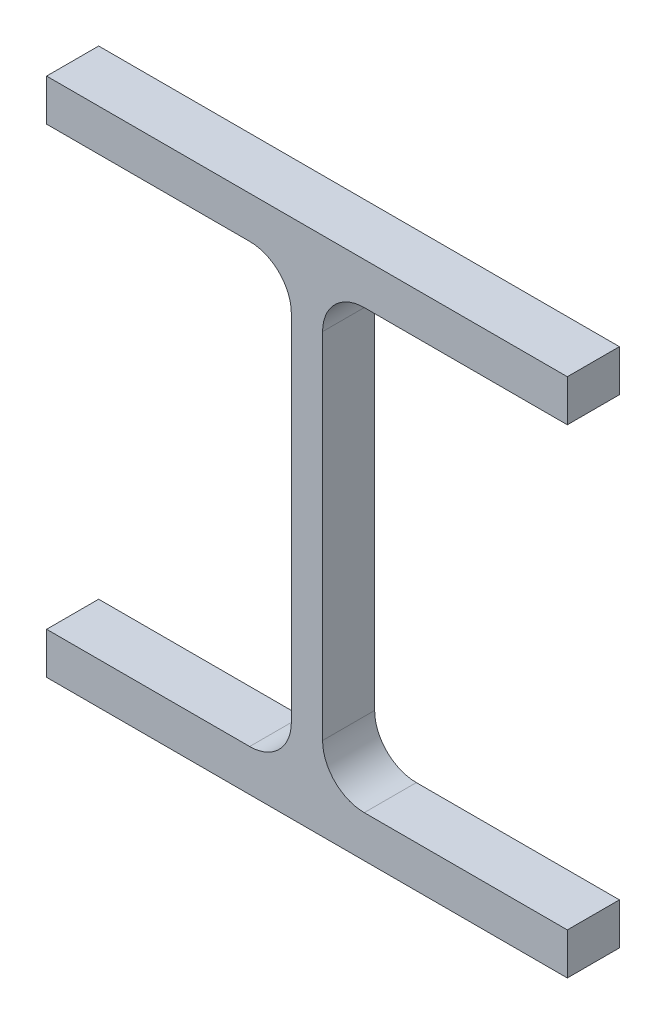
ISO-10303-21;
HEADER;
FILE_DESCRIPTION(('STEP AP214'),'2;1');
FILE_NAME('part.step','',(''),(''),'','','');
FILE_SCHEMA(('AUTOMOTIVE_DESIGN { 1 0 10303 214 1 1 1 1 }'));
ENDSEC;
DATA;
#1=APPLICATION_CONTEXT('core data for automotive mechanical design processes');
#2=APPLICATION_PROTOCOL_DEFINITION('international standard','automotive_design',2000,#1);
#3=PRODUCT_CONTEXT('',#1,'mechanical');
#4=PRODUCT('Part','Part','',(#3));
#5=PRODUCT_RELATED_PRODUCT_CATEGORY('part','',(#4));
#6=PRODUCT_DEFINITION_FORMATION('','',#4);
#7=PRODUCT_DEFINITION_CONTEXT('part definition',#1,'design');
#8=PRODUCT_DEFINITION('design','',#6,#7);
#9=PRODUCT_DEFINITION_SHAPE('','',#8);
#10=(LENGTH_UNIT() NAMED_UNIT(*) SI_UNIT(.MILLI.,.METRE.));
#11=(NAMED_UNIT(*) PLANE_ANGLE_UNIT() SI_UNIT($,.RADIAN.));
#12=(NAMED_UNIT(*) SI_UNIT($,.STERADIAN.) SOLID_ANGLE_UNIT());
#13=UNCERTAINTY_MEASURE_WITH_UNIT(LENGTH_MEASURE(1.E-05),#10,'distance_accuracy_value','');
#14=(GEOMETRIC_REPRESENTATION_CONTEXT(3) GLOBAL_UNCERTAINTY_ASSIGNED_CONTEXT((#13)) GLOBAL_UNIT_ASSIGNED_CONTEXT((#10,
#11,#12)) REPRESENTATION_CONTEXT('',''));
#15=CARTESIAN_POINT('',(0.,0.,0.));
#16=DIRECTION('',(0.,0.,1.));
#17=DIRECTION('',(1.,0.,0.));
#18=AXIS2_PLACEMENT_3D('',#15,#16,#17);
#19=CARTESIAN_POINT('',(50.,-50.,10.));
#20=DIRECTION('',(-1.,0.,0.));
#21=DIRECTION('',(0.,-1.,0.));
#22=AXIS2_PLACEMENT_3D('',#19,#20,#21);
#23=PLANE('',#22);
#24=DIRECTION('',(0.,1.,0.));
#25=VECTOR('',#24,1.);
#26=CARTESIAN_POINT('',(50.,-50.,0.));
#27=LINE('',#26,#25);
#28=CARTESIAN_POINT('',(50.,-50.,0.));
#29=VERTEX_POINT('',#28);
#30=CARTESIAN_POINT('',(50.,-42.,0.));
#31=VERTEX_POINT('',#30);
#32=EDGE_CURVE('E171',#29,#31,#27,.T.);
#33=ORIENTED_EDGE('',*,*,#32,.T.);
#34=DIRECTION('',(0.,0.,-1.));
#35=VECTOR('',#34,1.);
#36=CARTESIAN_POINT('',(50.,-42.,10.));
#37=LINE('',#36,#35);
#38=CARTESIAN_POINT('',(50.,-42.,10.));
#39=VERTEX_POINT('',#38);
#40=EDGE_CURVE('E152',#39,#31,#37,.T.);
#41=ORIENTED_EDGE('',*,*,#40,.F.);
#42=DIRECTION('',(0.,1.,0.));
#43=VECTOR('',#42,1.);
#44=CARTESIAN_POINT('',(50.,-50.,10.));
#45=LINE('',#44,#43);
#46=CARTESIAN_POINT('',(50.,-50.,10.));
#47=VERTEX_POINT('',#46);
#48=EDGE_CURVE('E159',#47,#39,#45,.T.);
#49=ORIENTED_EDGE('',*,*,#48,.F.);
#50=DIRECTION('',(0.,0.,-1.));
#51=VECTOR('',#50,1.);
#52=CARTESIAN_POINT('',(50.,-50.,10.));
#53=LINE('',#52,#51);
#54=EDGE_CURVE('E255',#47,#29,#53,.T.);
#55=ORIENTED_EDGE('',*,*,#54,.T.);
#56=EDGE_LOOP('',(#33,#41,#49,#55));
#57=FACE_BOUND('',#56,.T.);
#58=ADVANCED_FACE('F34',(#57),#23,.F.);
#59=CARTESIAN_POINT('',(50.,-42.,10.));
#60=DIRECTION('',(0.,-1.,0.));
#61=DIRECTION('',(1.,0.,0.));
#62=AXIS2_PLACEMENT_3D('',#59,#60,#61);
#63=PLANE('',#62);
#64=DIRECTION('',(-1.,0.,0.));
#65=VECTOR('',#64,1.);
#66=CARTESIAN_POINT('',(50.,-42.,0.));
#67=LINE('',#66,#65);
#68=CARTESIAN_POINT('',(11.,-42.,0.));
#69=VERTEX_POINT('',#68);
#70=EDGE_CURVE('E233',#31,#69,#67,.T.);
#71=ORIENTED_EDGE('',*,*,#70,.T.);
#72=DIRECTION('',(0.,0.,-1.));
#73=VECTOR('',#72,1.);
#74=CARTESIAN_POINT('',(11.,-42.,10.));
#75=LINE('',#74,#73);
#76=CARTESIAN_POINT('',(11.,-42.,10.));
#77=VERTEX_POINT('',#76);
#78=EDGE_CURVE('E155',#69,#77,#75,.F.);
#79=ORIENTED_EDGE('',*,*,#78,.T.);
#80=DIRECTION('',(-1.,0.,0.));
#81=VECTOR('',#80,1.);
#82=CARTESIAN_POINT('',(50.,-42.,10.));
#83=LINE('',#82,#81);
#84=EDGE_CURVE('E147',#39,#77,#83,.T.);
#85=ORIENTED_EDGE('',*,*,#84,.F.);
#86=ORIENTED_EDGE('',*,*,#40,.T.);
#87=EDGE_LOOP('',(#71,#79,#85,#86));
#88=FACE_BOUND('',#87,.T.);
#89=ADVANCED_FACE('F150',(#88),#63,.F.);
#90=CARTESIAN_POINT('',(2.99999999999999,42.,10.));
#91=DIRECTION('',(-1.,0.,0.));
#92=DIRECTION('',(0.,0.,1.));
#93=AXIS2_PLACEMENT_3D('',#90,#91,#92);
#94=PLANE('',#93);
#95=DIRECTION('',(0.,1.,0.));
#96=VECTOR('',#95,1.);
#97=CARTESIAN_POINT('',(2.99999999999999,42.,10.));
#98=LINE('',#97,#96);
#99=CARTESIAN_POINT('',(2.99999999999999,-34.,10.));
#100=VERTEX_POINT('',#99);
#101=CARTESIAN_POINT('',(2.99999999999999,34.,10.));
#102=VERTEX_POINT('',#101);
#103=EDGE_CURVE('E158',#100,#102,#98,.T.);
#104=ORIENTED_EDGE('',*,*,#103,.F.);
#105=DIRECTION('',(0.,0.,-1.));
#106=VECTOR('',#105,1.);
#107=CARTESIAN_POINT('',(2.99999999999999,-34.,0.));
#108=LINE('',#107,#106);
#109=CARTESIAN_POINT('',(2.99999999999999,-34.,0.));
#110=VERTEX_POINT('',#109);
#111=EDGE_CURVE('E189',#100,#110,#108,.T.);
#112=ORIENTED_EDGE('',*,*,#111,.T.);
#113=DIRECTION('',(0.,1.,0.));
#114=VECTOR('',#113,1.);
#115=CARTESIAN_POINT('',(2.99999999999999,42.,0.));
#116=LINE('',#115,#114);
#117=CARTESIAN_POINT('',(2.99999999999999,34.,0.));
#118=VERTEX_POINT('',#117);
#119=EDGE_CURVE('E227',#110,#118,#116,.T.);
#120=ORIENTED_EDGE('',*,*,#119,.T.);
#121=DIRECTION('',(0.,0.,-1.));
#122=VECTOR('',#121,1.);
#123=CARTESIAN_POINT('',(2.99999999999999,34.,10.));
#124=LINE('',#123,#122);
#125=EDGE_CURVE('E187',#118,#102,#124,.F.);
#126=ORIENTED_EDGE('',*,*,#125,.T.);
#127=EDGE_LOOP('',(#104,#112,#120,#126));
#128=FACE_BOUND('',#127,.T.);
#129=ADVANCED_FACE('F231',(#128),#94,.F.);
#130=CARTESIAN_POINT('',(50.,42.,10.));
#131=DIRECTION('',(0.,1.,0.));
#132=DIRECTION('',(-1.,0.,0.));
#133=AXIS2_PLACEMENT_3D('',#130,#131,#132);
#134=PLANE('',#133);
#135=DIRECTION('',(1.,0.,0.));
#136=VECTOR('',#135,1.);
#137=CARTESIAN_POINT('',(50.,42.,10.));
#138=LINE('',#137,#136);
#139=CARTESIAN_POINT('',(11.,42.,10.));
#140=VERTEX_POINT('',#139);
#141=CARTESIAN_POINT('',(50.,42.,10.));
#142=VERTEX_POINT('',#141);
#143=EDGE_CURVE('E211',#140,#142,#138,.T.);
#144=ORIENTED_EDGE('',*,*,#143,.F.);
#145=DIRECTION('',(0.,0.,-1.));
#146=VECTOR('',#145,1.);
#147=CARTESIAN_POINT('',(11.,42.,0.));
#148=LINE('',#147,#146);
#149=CARTESIAN_POINT('',(11.,42.,0.));
#150=VERTEX_POINT('',#149);
#151=EDGE_CURVE('E193',#140,#150,#148,.T.);
#152=ORIENTED_EDGE('',*,*,#151,.T.);
#153=DIRECTION('',(1.,0.,0.));
#154=VECTOR('',#153,1.);
#155=CARTESIAN_POINT('',(50.,42.,0.));
#156=LINE('',#155,#154);
#157=CARTESIAN_POINT('',(50.,42.,0.));
#158=VERTEX_POINT('',#157);
#159=EDGE_CURVE('E229',#150,#158,#156,.T.);
#160=ORIENTED_EDGE('',*,*,#159,.T.);
#161=DIRECTION('',(0.,0.,-1.));
#162=VECTOR('',#161,1.);
#163=CARTESIAN_POINT('',(50.,42.,10.));
#164=LINE('',#163,#162);
#165=EDGE_CURVE('E173',#142,#158,#164,.T.);
#166=ORIENTED_EDGE('',*,*,#165,.F.);
#167=EDGE_LOOP('',(#144,#152,#160,#166));
#168=FACE_BOUND('',#167,.T.);
#169=ADVANCED_FACE('F218',(#168),#134,.F.);
#170=CARTESIAN_POINT('',(50.,50.,10.));
#171=DIRECTION('',(-1.,0.,0.));
#172=DIRECTION('',(0.,-1.,0.));
#173=AXIS2_PLACEMENT_3D('',#170,#171,#172);
#174=PLANE('',#173);
#175=DIRECTION('',(0.,1.,0.));
#176=VECTOR('',#175,1.);
#177=CARTESIAN_POINT('',(50.,50.,0.));
#178=LINE('',#177,#176);
#179=CARTESIAN_POINT('',(50.,50.,0.));
#180=VERTEX_POINT('',#179);
#181=EDGE_CURVE('E235',#158,#180,#178,.T.);
#182=ORIENTED_EDGE('',*,*,#181,.T.);
#183=DIRECTION('',(0.,0.,-1.));
#184=VECTOR('',#183,1.);
#185=CARTESIAN_POINT('',(50.,50.,10.));
#186=LINE('',#185,#184);
#187=CARTESIAN_POINT('',(50.,50.,10.));
#188=VERTEX_POINT('',#187);
#189=EDGE_CURVE('E179',#188,#180,#186,.T.);
#190=ORIENTED_EDGE('',*,*,#189,.F.);
#191=DIRECTION('',(0.,1.,0.));
#192=VECTOR('',#191,1.);
#193=CARTESIAN_POINT('',(50.,50.,10.));
#194=LINE('',#193,#192);
#195=EDGE_CURVE('E221',#142,#188,#194,.T.);
#196=ORIENTED_EDGE('',*,*,#195,.F.);
#197=ORIENTED_EDGE('',*,*,#165,.T.);
#198=EDGE_LOOP('',(#182,#190,#196,#197));
#199=FACE_BOUND('',#198,.T.);
#200=ADVANCED_FACE('F311',(#199),#174,.F.);
#201=CARTESIAN_POINT('',(50.,50.,10.));
#202=DIRECTION('',(0.,-1.,0.));
#203=DIRECTION('',(0.,0.,-1.));
#204=AXIS2_PLACEMENT_3D('',#201,#202,#203);
#205=PLANE('',#204);
#206=DIRECTION('',(-1.,0.,0.));
#207=VECTOR('',#206,1.);
#208=CARTESIAN_POINT('',(50.,50.,0.));
#209=LINE('',#208,#207);
#210=CARTESIAN_POINT('',(-50.,50.,0.));
#211=VERTEX_POINT('',#210);
#212=EDGE_CURVE('E241',#180,#211,#209,.T.);
#213=ORIENTED_EDGE('',*,*,#212,.T.);
#214=DIRECTION('',(0.,0.,-1.));
#215=VECTOR('',#214,1.);
#216=CARTESIAN_POINT('',(-50.,50.,10.));
#217=LINE('',#216,#215);
#218=CARTESIAN_POINT('',(-50.,50.,10.));
#219=VERTEX_POINT('',#218);
#220=EDGE_CURVE('E266',#219,#211,#217,.T.);
#221=ORIENTED_EDGE('',*,*,#220,.F.);
#222=DIRECTION('',(-1.,0.,0.));
#223=VECTOR('',#222,1.);
#224=CARTESIAN_POINT('',(50.,50.,10.));
#225=LINE('',#224,#223);
#226=EDGE_CURVE('E275',#188,#219,#225,.T.);
#227=ORIENTED_EDGE('',*,*,#226,.F.);
#228=ORIENTED_EDGE('',*,*,#189,.T.);
#229=EDGE_LOOP('',(#213,#221,#227,#228));
#230=FACE_BOUND('',#229,.T.);
#231=ADVANCED_FACE('F273',(#230),#205,.F.);
#232=CARTESIAN_POINT('',(-50.,50.,10.));
#233=DIRECTION('',(1.,0.,0.));
#234=DIRECTION('',(0.,1.,0.));
#235=AXIS2_PLACEMENT_3D('',#232,#233,#234);
#236=PLANE('',#235);
#237=DIRECTION('',(0.,-1.,0.));
#238=VECTOR('',#237,1.);
#239=CARTESIAN_POINT('',(-50.,50.,0.));
#240=LINE('',#239,#238);
#241=CARTESIAN_POINT('',(-50.,42.,0.));
#242=VERTEX_POINT('',#241);
#243=EDGE_CURVE('E243',#211,#242,#240,.T.);
#244=ORIENTED_EDGE('',*,*,#243,.T.);
#245=DIRECTION('',(0.,0.,-1.));
#246=VECTOR('',#245,1.);
#247=CARTESIAN_POINT('',(-50.,42.,10.));
#248=LINE('',#247,#246);
#249=CARTESIAN_POINT('',(-50.,42.,10.));
#250=VERTEX_POINT('',#249);
#251=EDGE_CURVE('E263',#250,#242,#248,.T.);
#252=ORIENTED_EDGE('',*,*,#251,.F.);
#253=DIRECTION('',(0.,-1.,0.));
#254=VECTOR('',#253,1.);
#255=CARTESIAN_POINT('',(-50.,50.,10.));
#256=LINE('',#255,#254);
#257=EDGE_CURVE('E286',#219,#250,#256,.T.);
#258=ORIENTED_EDGE('',*,*,#257,.F.);
#259=ORIENTED_EDGE('',*,*,#220,.T.);
#260=EDGE_LOOP('',(#244,#252,#258,#259));
#261=FACE_BOUND('',#260,.T.);
#262=ADVANCED_FACE('F280',(#261),#236,.F.);
#263=CARTESIAN_POINT('',(-50.,42.,10.));
#264=DIRECTION('',(0.,1.,0.));
#265=DIRECTION('',(-1.,0.,0.));
#266=AXIS2_PLACEMENT_3D('',#263,#264,#265);
#267=PLANE('',#266);
#268=DIRECTION('',(1.,0.,0.));
#269=VECTOR('',#268,1.);
#270=CARTESIAN_POINT('',(-50.,42.,0.));
#271=LINE('',#270,#269);
#272=CARTESIAN_POINT('',(-11.,42.,0.));
#273=VERTEX_POINT('',#272);
#274=EDGE_CURVE('E245',#242,#273,#271,.T.);
#275=ORIENTED_EDGE('',*,*,#274,.T.);
#276=DIRECTION('',(0.,0.,-1.));
#277=VECTOR('',#276,1.);
#278=CARTESIAN_POINT('',(-11.,42.,10.));
#279=LINE('',#278,#277);
#280=CARTESIAN_POINT('',(-11.,42.,10.));
#281=VERTEX_POINT('',#280);
#282=EDGE_CURVE('E49',#273,#281,#279,.F.);
#283=ORIENTED_EDGE('',*,*,#282,.T.);
#284=DIRECTION('',(1.,0.,0.));
#285=VECTOR('',#284,1.);
#286=CARTESIAN_POINT('',(-50.,42.,10.));
#287=LINE('',#286,#285);
#288=EDGE_CURVE('E283',#250,#281,#287,.T.);
#289=ORIENTED_EDGE('',*,*,#288,.F.);
#290=ORIENTED_EDGE('',*,*,#251,.T.);
#291=EDGE_LOOP('',(#275,#283,#289,#290));
#292=FACE_BOUND('',#291,.T.);
#293=ADVANCED_FACE('F282',(#292),#267,.F.);
#294=CARTESIAN_POINT('',(-2.99999999999999,42.,10.));
#295=DIRECTION('',(1.,0.,0.));
#296=DIRECTION('',(0.,0.,-1.));
#297=AXIS2_PLACEMENT_3D('',#294,#295,#296);
#298=PLANE('',#297);
#299=DIRECTION('',(0.,-1.,0.));
#300=VECTOR('',#299,1.);
#301=CARTESIAN_POINT('',(-2.99999999999999,42.,0.));
#302=LINE('',#301,#300);
#303=CARTESIAN_POINT('',(-2.99999999999999,34.,0.));
#304=VERTEX_POINT('',#303);
#305=CARTESIAN_POINT('',(-2.99999999999999,-34.,0.));
#306=VERTEX_POINT('',#305);
#307=EDGE_CURVE('E247',#304,#306,#302,.T.);
#308=ORIENTED_EDGE('',*,*,#307,.T.);
#309=DIRECTION('',(0.,0.,-1.));
#310=VECTOR('',#309,1.);
#311=CARTESIAN_POINT('',(-2.99999999999999,-34.,10.));
#312=LINE('',#311,#310);
#313=CARTESIAN_POINT('',(-2.99999999999999,-34.,10.));
#314=VERTEX_POINT('',#313);
#315=EDGE_CURVE('E185',#306,#314,#312,.F.);
#316=ORIENTED_EDGE('',*,*,#315,.T.);
#317=DIRECTION('',(0.,-1.,0.));
#318=VECTOR('',#317,1.);
#319=CARTESIAN_POINT('',(-2.99999999999999,42.,10.));
#320=LINE('',#319,#318);
#321=CARTESIAN_POINT('',(-2.99999999999999,34.,10.));
#322=VERTEX_POINT('',#321);
#323=EDGE_CURVE('E285',#322,#314,#320,.T.);
#324=ORIENTED_EDGE('',*,*,#323,.F.);
#325=DIRECTION('',(0.,0.,-1.));
#326=VECTOR('',#325,1.);
#327=CARTESIAN_POINT('',(-2.99999999999999,34.,0.));
#328=LINE('',#327,#326);
#329=EDGE_CURVE('E176',#322,#304,#328,.T.);
#330=ORIENTED_EDGE('',*,*,#329,.T.);
#331=EDGE_LOOP('',(#308,#316,#324,#330));
#332=FACE_BOUND('',#331,.T.);
#333=ADVANCED_FACE('F344',(#332),#298,.F.);
#334=CARTESIAN_POINT('',(-50.,-42.,10.));
#335=DIRECTION('',(0.,-1.,0.));
#336=DIRECTION('',(1.,0.,0.));
#337=AXIS2_PLACEMENT_3D('',#334,#335,#336);
#338=PLANE('',#337);
#339=DIRECTION('',(-1.,0.,0.));
#340=VECTOR('',#339,1.);
#341=CARTESIAN_POINT('',(-50.,-42.,10.));
#342=LINE('',#341,#340);
#343=CARTESIAN_POINT('',(-11.,-42.,10.));
#344=VERTEX_POINT('',#343);
#345=CARTESIAN_POINT('',(-50.,-42.,10.));
#346=VERTEX_POINT('',#345);
#347=EDGE_CURVE('E289',#344,#346,#342,.T.);
#348=ORIENTED_EDGE('',*,*,#347,.F.);
#349=DIRECTION('',(0.,0.,-1.));
#350=VECTOR('',#349,1.);
#351=CARTESIAN_POINT('',(-11.,-42.,0.));
#352=LINE('',#351,#350);
#353=CARTESIAN_POINT('',(-11.,-42.,0.));
#354=VERTEX_POINT('',#353);
#355=EDGE_CURVE('E172',#344,#354,#352,.T.);
#356=ORIENTED_EDGE('',*,*,#355,.T.);
#357=DIRECTION('',(-1.,0.,0.));
#358=VECTOR('',#357,1.);
#359=CARTESIAN_POINT('',(-50.,-42.,0.));
#360=LINE('',#359,#358);
#361=CARTESIAN_POINT('',(-50.,-42.,0.));
#362=VERTEX_POINT('',#361);
#363=EDGE_CURVE('E250',#354,#362,#360,.T.);
#364=ORIENTED_EDGE('',*,*,#363,.T.);
#365=DIRECTION('',(0.,0.,-1.));
#366=VECTOR('',#365,1.);
#367=CARTESIAN_POINT('',(-50.,-42.,10.));
#368=LINE('',#367,#366);
#369=EDGE_CURVE('E260',#346,#362,#368,.T.);
#370=ORIENTED_EDGE('',*,*,#369,.F.);
#371=EDGE_LOOP('',(#348,#356,#364,#370));
#372=FACE_BOUND('',#371,.T.);
#373=ADVANCED_FACE('F348',(#372),#338,.F.);
#374=CARTESIAN_POINT('',(-50.,-50.,10.));
#375=DIRECTION('',(1.,0.,0.));
#376=DIRECTION('',(0.,1.,0.));
#377=AXIS2_PLACEMENT_3D('',#374,#375,#376);
#378=PLANE('',#377);
#379=DIRECTION('',(0.,-1.,0.));
#380=VECTOR('',#379,1.);
#381=CARTESIAN_POINT('',(-50.,-50.,0.));
#382=LINE('',#381,#380);
#383=CARTESIAN_POINT('',(-50.,-50.,0.));
#384=VERTEX_POINT('',#383);
#385=EDGE_CURVE('E252',#362,#384,#382,.T.);
#386=ORIENTED_EDGE('',*,*,#385,.T.);
#387=DIRECTION('',(0.,0.,-1.));
#388=VECTOR('',#387,1.);
#389=CARTESIAN_POINT('',(-50.,-50.,10.));
#390=LINE('',#389,#388);
#391=CARTESIAN_POINT('',(-50.,-50.,10.));
#392=VERTEX_POINT('',#391);
#393=EDGE_CURVE('E257',#392,#384,#390,.T.);
#394=ORIENTED_EDGE('',*,*,#393,.F.);
#395=DIRECTION('',(0.,-1.,0.));
#396=VECTOR('',#395,1.);
#397=CARTESIAN_POINT('',(-50.,-50.,10.));
#398=LINE('',#397,#396);
#399=EDGE_CURVE('E295',#346,#392,#398,.T.);
#400=ORIENTED_EDGE('',*,*,#399,.F.);
#401=ORIENTED_EDGE('',*,*,#369,.T.);
#402=EDGE_LOOP('',(#386,#394,#400,#401));
#403=FACE_BOUND('',#402,.T.);
#404=ADVANCED_FACE('F302',(#403),#378,.F.);
#405=CARTESIAN_POINT('',(50.,-50.,10.));
#406=DIRECTION('',(0.,1.,0.));
#407=DIRECTION('',(0.,0.,1.));
#408=AXIS2_PLACEMENT_3D('',#405,#406,#407);
#409=PLANE('',#408);
#410=DIRECTION('',(1.,0.,0.));
#411=VECTOR('',#410,1.);
#412=CARTESIAN_POINT('',(50.,-50.,0.));
#413=LINE('',#412,#411);
#414=EDGE_CURVE('E168',#384,#29,#413,.T.);
#415=ORIENTED_EDGE('',*,*,#414,.T.);
#416=ORIENTED_EDGE('',*,*,#54,.F.);
#417=DIRECTION('',(1.,0.,0.));
#418=VECTOR('',#417,1.);
#419=CARTESIAN_POINT('',(50.,-50.,10.));
#420=LINE('',#419,#418);
#421=EDGE_CURVE('E164',#392,#47,#420,.T.);
#422=ORIENTED_EDGE('',*,*,#421,.F.);
#423=ORIENTED_EDGE('',*,*,#393,.T.);
#424=EDGE_LOOP('',(#415,#416,#422,#423));
#425=FACE_BOUND('',#424,.T.);
#426=ADVANCED_FACE('F306',(#425),#409,.F.);
#427=CARTESIAN_POINT('',(50.,-42.,10.));
#428=DIRECTION('',(0.,0.,1.));
#429=DIRECTION('',(1.,0.,0.));
#430=AXIS2_PLACEMENT_3D('',#427,#428,#429);
#431=PLANE('',#430);
#432=ORIENTED_EDGE('',*,*,#48,.T.);
#433=ORIENTED_EDGE('',*,*,#84,.T.);
#434=CARTESIAN_POINT('',(11.,-34.,10.));
#435=DIRECTION('',(0.,0.,1.));
#436=DIRECTION('',(1.,0.,0.));
#437=AXIS2_PLACEMENT_3D('',#434,#435,#436);
#438=CIRCLE('',#437,8.);
#439=EDGE_CURVE('E203',#77,#100,#438,.F.);
#440=ORIENTED_EDGE('',*,*,#439,.T.);
#441=ORIENTED_EDGE('',*,*,#103,.T.);
#442=CARTESIAN_POINT('',(11.,34.,10.));
#443=DIRECTION('',(0.,0.,1.));
#444=DIRECTION('',(1.,0.,0.));
#445=AXIS2_PLACEMENT_3D('',#442,#443,#444);
#446=CIRCLE('',#445,8.);
#447=EDGE_CURVE('E207',#102,#140,#446,.F.);
#448=ORIENTED_EDGE('',*,*,#447,.T.);
#449=ORIENTED_EDGE('',*,*,#143,.T.);
#450=ORIENTED_EDGE('',*,*,#195,.T.);
#451=ORIENTED_EDGE('',*,*,#226,.T.);
#452=ORIENTED_EDGE('',*,*,#257,.T.);
#453=ORIENTED_EDGE('',*,*,#288,.T.);
#454=CARTESIAN_POINT('',(-11.,34.,10.));
#455=DIRECTION('',(0.,0.,1.));
#456=DIRECTION('',(1.,0.,0.));
#457=AXIS2_PLACEMENT_3D('',#454,#455,#456);
#458=CIRCLE('',#457,8.);
#459=EDGE_CURVE('E11',#281,#322,#458,.F.);
#460=ORIENTED_EDGE('',*,*,#459,.T.);
#461=ORIENTED_EDGE('',*,*,#323,.T.);
#462=CARTESIAN_POINT('',(-11.,-34.,10.));
#463=DIRECTION('',(0.,0.,1.));
#464=DIRECTION('',(1.,0.,0.));
#465=AXIS2_PLACEMENT_3D('',#462,#463,#464);
#466=CIRCLE('',#465,8.);
#467=EDGE_CURVE('E199',#314,#344,#466,.F.);
#468=ORIENTED_EDGE('',*,*,#467,.T.);
#469=ORIENTED_EDGE('',*,*,#347,.T.);
#470=ORIENTED_EDGE('',*,*,#399,.T.);
#471=ORIENTED_EDGE('',*,*,#421,.T.);
#472=EDGE_LOOP('',(#432,#433,#440,#441,#448,#449,#450,#451,#452,#453,#460,#461,#468,#469,#470,#471));
#473=FACE_BOUND('',#472,.T.);
#474=ADVANCED_FACE('F162',(#473),#431,.T.);
#475=CARTESIAN_POINT('',(50.,-42.,0.));
#476=DIRECTION('',(0.,0.,1.));
#477=DIRECTION('',(1.,0.,0.));
#478=AXIS2_PLACEMENT_3D('',#475,#476,#477);
#479=PLANE('',#478);
#480=ORIENTED_EDGE('',*,*,#32,.F.);
#481=ORIENTED_EDGE('',*,*,#414,.F.);
#482=ORIENTED_EDGE('',*,*,#385,.F.);
#483=ORIENTED_EDGE('',*,*,#363,.F.);
#484=CARTESIAN_POINT('',(-11.,-34.,0.));
#485=DIRECTION('',(0.,0.,1.));
#486=DIRECTION('',(1.,0.,0.));
#487=AXIS2_PLACEMENT_3D('',#484,#485,#486);
#488=CIRCLE('',#487,8.);
#489=EDGE_CURVE('E197',#354,#306,#488,.T.);
#490=ORIENTED_EDGE('',*,*,#489,.T.);
#491=ORIENTED_EDGE('',*,*,#307,.F.);
#492=CARTESIAN_POINT('',(-11.,34.,0.));
#493=DIRECTION('',(0.,0.,1.));
#494=DIRECTION('',(1.,0.,0.));
#495=AXIS2_PLACEMENT_3D('',#492,#493,#494);
#496=CIRCLE('',#495,8.);
#497=EDGE_CURVE('E42',#304,#273,#496,.T.);
#498=ORIENTED_EDGE('',*,*,#497,.T.);
#499=ORIENTED_EDGE('',*,*,#274,.F.);
#500=ORIENTED_EDGE('',*,*,#243,.F.);
#501=ORIENTED_EDGE('',*,*,#212,.F.);
#502=ORIENTED_EDGE('',*,*,#181,.F.);
#503=ORIENTED_EDGE('',*,*,#159,.F.);
#504=CARTESIAN_POINT('',(11.,34.,0.));
#505=DIRECTION('',(0.,0.,1.));
#506=DIRECTION('',(1.,0.,0.));
#507=AXIS2_PLACEMENT_3D('',#504,#505,#506);
#508=CIRCLE('',#507,8.);
#509=EDGE_CURVE('E205',#150,#118,#508,.T.);
#510=ORIENTED_EDGE('',*,*,#509,.T.);
#511=ORIENTED_EDGE('',*,*,#119,.F.);
#512=CARTESIAN_POINT('',(11.,-34.,0.));
#513=DIRECTION('',(0.,0.,1.));
#514=DIRECTION('',(1.,0.,0.));
#515=AXIS2_PLACEMENT_3D('',#512,#513,#514);
#516=CIRCLE('',#515,8.);
#517=EDGE_CURVE('E201',#110,#69,#516,.T.);
#518=ORIENTED_EDGE('',*,*,#517,.T.);
#519=ORIENTED_EDGE('',*,*,#70,.F.);
#520=EDGE_LOOP('',(#480,#481,#482,#483,#490,#491,#498,#499,#500,#501,#502,#503,#510,#511,#518,#519));
#521=FACE_BOUND('',#520,.T.);
#522=ADVANCED_FACE('F226',(#521),#479,.F.);
#523=CARTESIAN_POINT('',(-11.,-34.,10.));
#524=DIRECTION('',(0.,0.,1.));
#525=DIRECTION('',(1.,0.,0.));
#526=AXIS2_PLACEMENT_3D('',#523,#524,#525);
#527=CYLINDRICAL_SURFACE('',#526,8.);
#528=ORIENTED_EDGE('',*,*,#467,.F.);
#529=ORIENTED_EDGE('',*,*,#315,.F.);
#530=ORIENTED_EDGE('',*,*,#489,.F.);
#531=ORIENTED_EDGE('',*,*,#355,.F.);
#532=EDGE_LOOP('',(#528,#529,#530,#531));
#533=FACE_BOUND('',#532,.T.);
#534=ADVANCED_FACE('F328',(#533),#527,.F.);
#535=CARTESIAN_POINT('',(11.,-34.,10.));
#536=DIRECTION('',(0.,0.,1.));
#537=DIRECTION('',(1.,0.,0.));
#538=AXIS2_PLACEMENT_3D('',#535,#536,#537);
#539=CYLINDRICAL_SURFACE('',#538,8.);
#540=ORIENTED_EDGE('',*,*,#439,.F.);
#541=ORIENTED_EDGE('',*,*,#78,.F.);
#542=ORIENTED_EDGE('',*,*,#517,.F.);
#543=ORIENTED_EDGE('',*,*,#111,.F.);
#544=EDGE_LOOP('',(#540,#541,#542,#543));
#545=FACE_BOUND('',#544,.T.);
#546=ADVANCED_FACE('F308',(#545),#539,.F.);
#547=CARTESIAN_POINT('',(11.,34.,10.));
#548=DIRECTION('',(0.,0.,1.));
#549=DIRECTION('',(1.,0.,0.));
#550=AXIS2_PLACEMENT_3D('',#547,#548,#549);
#551=CYLINDRICAL_SURFACE('',#550,8.);
#552=ORIENTED_EDGE('',*,*,#447,.F.);
#553=ORIENTED_EDGE('',*,*,#125,.F.);
#554=ORIENTED_EDGE('',*,*,#509,.F.);
#555=ORIENTED_EDGE('',*,*,#151,.F.);
#556=EDGE_LOOP('',(#552,#553,#554,#555));
#557=FACE_BOUND('',#556,.T.);
#558=ADVANCED_FACE('F223',(#557),#551,.F.);
#559=CARTESIAN_POINT('',(-11.,34.,10.));
#560=DIRECTION('',(0.,0.,1.));
#561=DIRECTION('',(1.,0.,0.));
#562=AXIS2_PLACEMENT_3D('',#559,#560,#561);
#563=CYLINDRICAL_SURFACE('',#562,8.);
#564=ORIENTED_EDGE('',*,*,#459,.F.);
#565=ORIENTED_EDGE('',*,*,#282,.F.);
#566=ORIENTED_EDGE('',*,*,#497,.F.);
#567=ORIENTED_EDGE('',*,*,#329,.F.);
#568=EDGE_LOOP('',(#564,#565,#566,#567));
#569=FACE_BOUND('',#568,.T.);
#570=ADVANCED_FACE('F36',(#569),#563,.F.);
#571=CLOSED_SHELL('',(#58,#89,#129,#169,#200,#231,#262,#293,#333,#373,#404,#426,#474,#522,#534,
#546,#558,#570));
#572=MANIFOLD_SOLID_BREP('B2',#571);
#573=ADVANCED_BREP_SHAPE_REPRESENTATION('',(#18,#572),#14);
#574=SHAPE_DEFINITION_REPRESENTATION(#9,#573);
ENDSEC;
END-ISO-10303-21;
